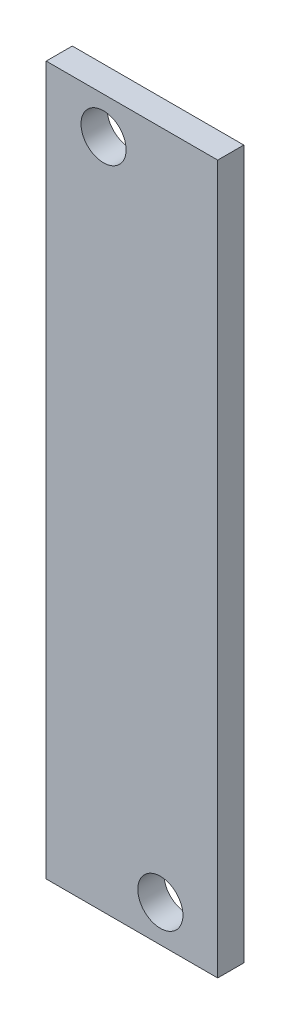
ISO-10303-21;
HEADER;
FILE_DESCRIPTION(('STEP AP214'),'2;1');
FILE_NAME('part.step','',(''),(''),'','','');
FILE_SCHEMA(('AUTOMOTIVE_DESIGN { 1 0 10303 214 1 1 1 1 }'));
ENDSEC;
DATA;
#1=APPLICATION_CONTEXT('core data for automotive mechanical design processes');
#2=APPLICATION_PROTOCOL_DEFINITION('international standard','automotive_design',2000,#1);
#3=PRODUCT_CONTEXT('',#1,'mechanical');
#4=PRODUCT('Part','Part','',(#3));
#5=PRODUCT_RELATED_PRODUCT_CATEGORY('part','',(#4));
#6=PRODUCT_DEFINITION_FORMATION('','',#4);
#7=PRODUCT_DEFINITION_CONTEXT('part definition',#1,'design');
#8=PRODUCT_DEFINITION('design','',#6,#7);
#9=PRODUCT_DEFINITION_SHAPE('','',#8);
#10=(LENGTH_UNIT() NAMED_UNIT(*) SI_UNIT(.MILLI.,.METRE.));
#11=(NAMED_UNIT(*) PLANE_ANGLE_UNIT() SI_UNIT($,.RADIAN.));
#12=(NAMED_UNIT(*) SI_UNIT($,.STERADIAN.) SOLID_ANGLE_UNIT());
#13=UNCERTAINTY_MEASURE_WITH_UNIT(LENGTH_MEASURE(1.E-05),#10,'distance_accuracy_value','');
#14=(GEOMETRIC_REPRESENTATION_CONTEXT(3) GLOBAL_UNCERTAINTY_ASSIGNED_CONTEXT((#13)) GLOBAL_UNIT_ASSIGNED_CONTEXT((#10,
#11,#12)) REPRESENTATION_CONTEXT('',''));
#15=CARTESIAN_POINT('',(0.,0.,0.));
#16=DIRECTION('',(0.,0.,1.));
#17=DIRECTION('',(1.,0.,0.));
#18=AXIS2_PLACEMENT_3D('',#15,#16,#17);
#19=CARTESIAN_POINT('',(11.5,0.,3.5));
#20=DIRECTION('',(1.,0.,0.));
#21=DIRECTION('',(0.,1.,0.));
#22=AXIS2_PLACEMENT_3D('',#19,#20,#21);
#23=PLANE('',#22);
#24=DIRECTION('',(0.,-1.,0.));
#25=VECTOR('',#24,1.);
#26=CARTESIAN_POINT('',(11.5,0.,0.));
#27=LINE('',#26,#25);
#28=CARTESIAN_POINT('',(11.5,47.5,0.));
#29=VERTEX_POINT('',#28);
#30=CARTESIAN_POINT('',(11.5,-47.5,0.));
#31=VERTEX_POINT('',#30);
#32=EDGE_CURVE('E111',#29,#31,#27,.T.);
#33=ORIENTED_EDGE('',*,*,#32,.F.);
#34=DIRECTION('',(0.,0.,-1.));
#35=VECTOR('',#34,1.);
#36=CARTESIAN_POINT('',(11.5,47.5,3.5));
#37=LINE('',#36,#35);
#38=CARTESIAN_POINT('',(11.5,47.5,3.5));
#39=VERTEX_POINT('',#38);
#40=EDGE_CURVE('E11',#39,#29,#37,.T.);
#41=ORIENTED_EDGE('',*,*,#40,.F.);
#42=DIRECTION('',(0.,-1.,0.));
#43=VECTOR('',#42,1.);
#44=CARTESIAN_POINT('',(11.5,0.,3.5));
#45=LINE('',#44,#43);
#46=CARTESIAN_POINT('',(11.5,-47.5,3.5));
#47=VERTEX_POINT('',#46);
#48=EDGE_CURVE('E98',#39,#47,#45,.T.);
#49=ORIENTED_EDGE('',*,*,#48,.T.);
#50=DIRECTION('',(0.,0.,-1.));
#51=VECTOR('',#50,1.);
#52=CARTESIAN_POINT('',(11.5,-47.5,3.5));
#53=LINE('',#52,#51);
#54=EDGE_CURVE('E77',#47,#31,#53,.T.);
#55=ORIENTED_EDGE('',*,*,#54,.T.);
#56=EDGE_LOOP('',(#33,#41,#49,#55));
#57=FACE_BOUND('',#56,.T.);
#58=ADVANCED_FACE('F37',(#57),#23,.T.);
#59=CARTESIAN_POINT('',(0.,47.5,3.5));
#60=DIRECTION('',(0.,1.,0.));
#61=DIRECTION('',(0.,0.,1.));
#62=AXIS2_PLACEMENT_3D('',#59,#60,#61);
#63=PLANE('',#62);
#64=DIRECTION('',(1.,0.,0.));
#65=VECTOR('',#64,1.);
#66=CARTESIAN_POINT('',(0.,47.5,0.));
#67=LINE('',#66,#65);
#68=CARTESIAN_POINT('',(-11.5,47.5,0.));
#69=VERTEX_POINT('',#68);
#70=EDGE_CURVE('E89',#69,#29,#67,.T.);
#71=ORIENTED_EDGE('',*,*,#70,.F.);
#72=DIRECTION('',(0.,0.,-1.));
#73=VECTOR('',#72,1.);
#74=CARTESIAN_POINT('',(-11.5,47.5,3.5));
#75=LINE('',#74,#73);
#76=CARTESIAN_POINT('',(-11.5,47.5,3.5));
#77=VERTEX_POINT('',#76);
#78=EDGE_CURVE('E46',#77,#69,#75,.T.);
#79=ORIENTED_EDGE('',*,*,#78,.F.);
#80=DIRECTION('',(1.,0.,0.));
#81=VECTOR('',#80,1.);
#82=CARTESIAN_POINT('',(0.,47.5,3.5));
#83=LINE('',#82,#81);
#84=EDGE_CURVE('E87',#77,#39,#83,.T.);
#85=ORIENTED_EDGE('',*,*,#84,.T.);
#86=ORIENTED_EDGE('',*,*,#40,.T.);
#87=EDGE_LOOP('',(#71,#79,#85,#86));
#88=FACE_BOUND('',#87,.T.);
#89=ADVANCED_FACE('F85',(#88),#63,.T.);
#90=CARTESIAN_POINT('',(-11.5,0.,3.5));
#91=DIRECTION('',(1.,0.,0.));
#92=DIRECTION('',(0.,1.,0.));
#93=AXIS2_PLACEMENT_3D('',#90,#91,#92);
#94=PLANE('',#93);
#95=DIRECTION('',(0.,-1.,0.));
#96=VECTOR('',#95,1.);
#97=CARTESIAN_POINT('',(-11.5,0.,0.));
#98=LINE('',#97,#96);
#99=CARTESIAN_POINT('',(-11.5,-47.5,0.));
#100=VERTEX_POINT('',#99);
#101=EDGE_CURVE('E114',#69,#100,#98,.T.);
#102=ORIENTED_EDGE('',*,*,#101,.T.);
#103=DIRECTION('',(0.,0.,-1.));
#104=VECTOR('',#103,1.);
#105=CARTESIAN_POINT('',(-11.5,-47.5,3.5));
#106=LINE('',#105,#104);
#107=CARTESIAN_POINT('',(-11.5,-47.5,3.5));
#108=VERTEX_POINT('',#107);
#109=EDGE_CURVE('E92',#108,#100,#106,.T.);
#110=ORIENTED_EDGE('',*,*,#109,.F.);
#111=DIRECTION('',(0.,-1.,0.));
#112=VECTOR('',#111,1.);
#113=CARTESIAN_POINT('',(-11.5,0.,3.5));
#114=LINE('',#113,#112);
#115=EDGE_CURVE('E94',#77,#108,#114,.T.);
#116=ORIENTED_EDGE('',*,*,#115,.F.);
#117=ORIENTED_EDGE('',*,*,#78,.T.);
#118=EDGE_LOOP('',(#102,#110,#116,#117));
#119=FACE_BOUND('',#118,.T.);
#120=ADVANCED_FACE('F95',(#119),#94,.F.);
#121=CARTESIAN_POINT('',(-3.81000000000001,42.55135,3.5));
#122=DIRECTION('',(0.,0.,-1.));
#123=DIRECTION('',(-1.,0.,0.));
#124=AXIS2_PLACEMENT_3D('',#121,#122,#123);
#125=CYLINDRICAL_SURFACE('',#124,3.025);
#126=CARTESIAN_POINT('',(-3.81000000000001,42.55135,3.5));
#127=DIRECTION('',(0.,0.,1.));
#128=DIRECTION('',(1.,0.,0.));
#129=AXIS2_PLACEMENT_3D('',#126,#127,#128);
#130=CIRCLE('',#129,3.025);
#131=CARTESIAN_POINT('',(-0.785000000000005,42.55135,3.5));
#132=VERTEX_POINT('',#131);
#133=EDGE_CURVE('E100',#132,#132,#130,.T.);
#134=ORIENTED_EDGE('',*,*,#133,.T.);
#135=EDGE_LOOP('',(#134));
#136=FACE_BOUND('',#135,.T.);
#137=CARTESIAN_POINT('',(-3.81000000000001,42.55135,0.));
#138=DIRECTION('',(0.,0.,1.));
#139=DIRECTION('',(1.,0.,0.));
#140=AXIS2_PLACEMENT_3D('',#137,#138,#139);
#141=CIRCLE('',#140,3.025);
#142=CARTESIAN_POINT('',(-0.785000000000005,42.55135,0.));
#143=VERTEX_POINT('',#142);
#144=EDGE_CURVE('E108',#143,#143,#141,.T.);
#145=ORIENTED_EDGE('',*,*,#144,.F.);
#146=EDGE_LOOP('',(#145));
#147=FACE_BOUND('',#146,.T.);
#148=ADVANCED_FACE('F129',(#136,#147),#125,.F.);
#149=CARTESIAN_POINT('',(3.81,-42.55135,3.5));
#150=DIRECTION('',(0.,0.,-1.));
#151=DIRECTION('',(-1.,0.,0.));
#152=AXIS2_PLACEMENT_3D('',#149,#150,#151);
#153=CYLINDRICAL_SURFACE('',#152,3.025);
#154=CARTESIAN_POINT('',(3.81,-42.55135,3.5));
#155=DIRECTION('',(0.,0.,1.));
#156=DIRECTION('',(1.,0.,0.));
#157=AXIS2_PLACEMENT_3D('',#154,#155,#156);
#158=CIRCLE('',#157,3.025);
#159=CARTESIAN_POINT('',(6.835,-42.55135,3.5));
#160=VERTEX_POINT('',#159);
#161=EDGE_CURVE('E117',#160,#160,#158,.T.);
#162=ORIENTED_EDGE('',*,*,#161,.T.);
#163=EDGE_LOOP('',(#162));
#164=FACE_BOUND('',#163,.T.);
#165=CARTESIAN_POINT('',(3.81,-42.55135,0.));
#166=DIRECTION('',(0.,0.,1.));
#167=DIRECTION('',(1.,0.,0.));
#168=AXIS2_PLACEMENT_3D('',#165,#166,#167);
#169=CIRCLE('',#168,3.025);
#170=CARTESIAN_POINT('',(6.835,-42.55135,0.));
#171=VERTEX_POINT('',#170);
#172=EDGE_CURVE('E105',#171,#171,#169,.T.);
#173=ORIENTED_EDGE('',*,*,#172,.F.);
#174=EDGE_LOOP('',(#173));
#175=FACE_BOUND('',#174,.T.);
#176=ADVANCED_FACE('F39',(#164,#175),#153,.F.);
#177=CARTESIAN_POINT('',(0.,-47.5,3.5));
#178=DIRECTION('',(0.,1.,0.));
#179=DIRECTION('',(0.,0.,1.));
#180=AXIS2_PLACEMENT_3D('',#177,#178,#179);
#181=PLANE('',#180);
#182=DIRECTION('',(1.,0.,0.));
#183=VECTOR('',#182,1.);
#184=CARTESIAN_POINT('',(0.,-47.5,0.));
#185=LINE('',#184,#183);
#186=EDGE_CURVE('E70',#100,#31,#185,.T.);
#187=ORIENTED_EDGE('',*,*,#186,.T.);
#188=ORIENTED_EDGE('',*,*,#54,.F.);
#189=DIRECTION('',(1.,0.,0.));
#190=VECTOR('',#189,1.);
#191=CARTESIAN_POINT('',(0.,-47.5,3.5));
#192=LINE('',#191,#190);
#193=EDGE_CURVE('E54',#108,#47,#192,.T.);
#194=ORIENTED_EDGE('',*,*,#193,.F.);
#195=ORIENTED_EDGE('',*,*,#109,.T.);
#196=EDGE_LOOP('',(#187,#188,#194,#195));
#197=FACE_BOUND('',#196,.T.);
#198=ADVANCED_FACE('F120',(#197),#181,.F.);
#199=CARTESIAN_POINT('',(0.,0.,3.5));
#200=DIRECTION('',(0.,0.,1.));
#201=DIRECTION('',(1.,0.,0.));
#202=AXIS2_PLACEMENT_3D('',#199,#200,#201);
#203=PLANE('',#202);
#204=ORIENTED_EDGE('',*,*,#161,.F.);
#205=EDGE_LOOP('',(#204));
#206=FACE_BOUND('',#205,.T.);
#207=ORIENTED_EDGE('',*,*,#133,.F.);
#208=EDGE_LOOP('',(#207));
#209=FACE_BOUND('',#208,.T.);
#210=ORIENTED_EDGE('',*,*,#48,.F.);
#211=ORIENTED_EDGE('',*,*,#84,.F.);
#212=ORIENTED_EDGE('',*,*,#115,.T.);
#213=ORIENTED_EDGE('',*,*,#193,.T.);
#214=EDGE_LOOP('',(#210,#211,#212,#213));
#215=FACE_BOUND('',#214,.T.);
#216=ADVANCED_FACE('F97',(#206,#209,#215),#203,.T.);
#217=CARTESIAN_POINT('',(0.,0.,0.));
#218=DIRECTION('',(0.,0.,1.));
#219=DIRECTION('',(1.,0.,0.));
#220=AXIS2_PLACEMENT_3D('',#217,#218,#219);
#221=PLANE('',#220);
#222=ORIENTED_EDGE('',*,*,#172,.T.);
#223=EDGE_LOOP('',(#222));
#224=FACE_BOUND('',#223,.T.);
#225=ORIENTED_EDGE('',*,*,#144,.T.);
#226=EDGE_LOOP('',(#225));
#227=FACE_BOUND('',#226,.T.);
#228=ORIENTED_EDGE('',*,*,#32,.T.);
#229=ORIENTED_EDGE('',*,*,#186,.F.);
#230=ORIENTED_EDGE('',*,*,#101,.F.);
#231=ORIENTED_EDGE('',*,*,#70,.T.);
#232=EDGE_LOOP('',(#228,#229,#230,#231));
#233=FACE_BOUND('',#232,.T.);
#234=ADVANCED_FACE('F121',(#224,#227,#233),#221,.F.);
#235=CLOSED_SHELL('',(#58,#89,#120,#148,#176,#198,#216,#234));
#236=MANIFOLD_SOLID_BREP('B2',#235);
#237=ADVANCED_BREP_SHAPE_REPRESENTATION('',(#18,#236),#14);
#238=SHAPE_DEFINITION_REPRESENTATION(#9,#237);
ENDSEC;
END-ISO-10303-21;
